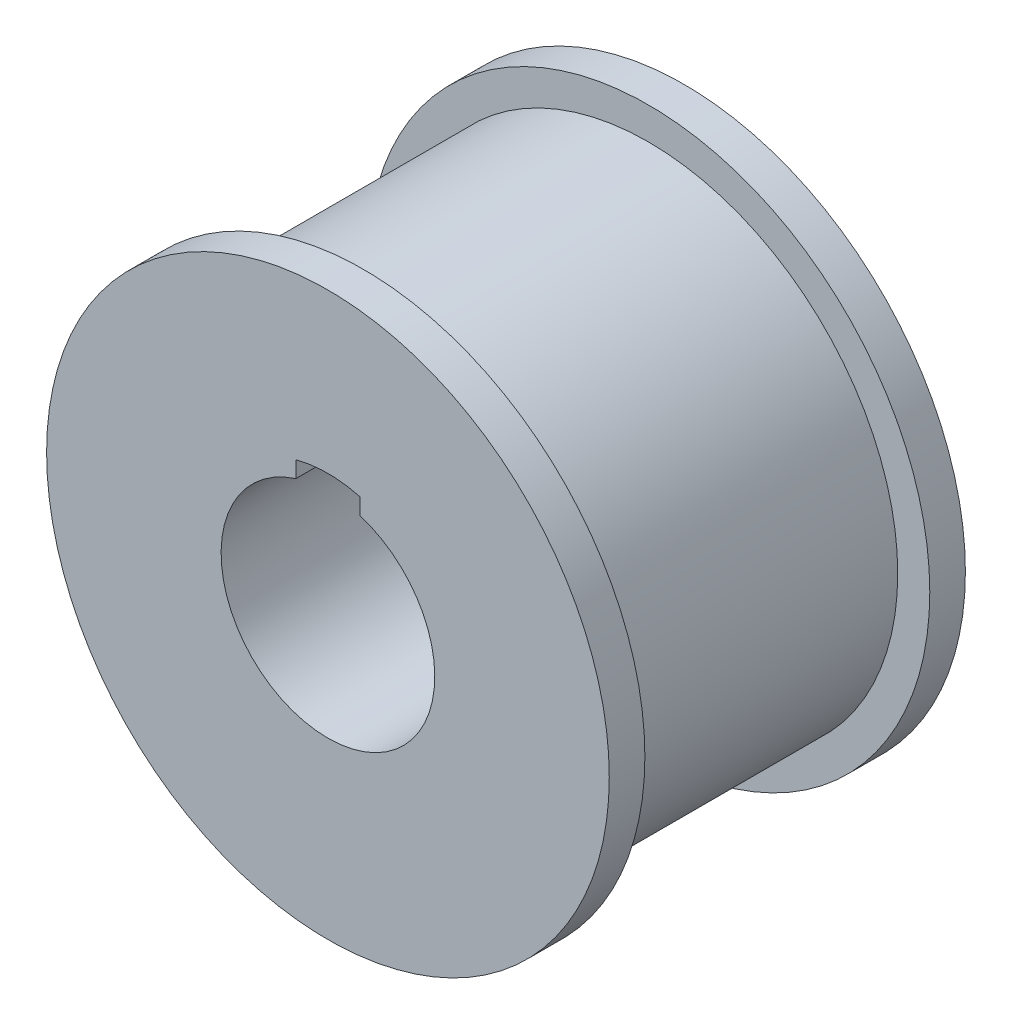
ISO-10303-21;
HEADER;
FILE_DESCRIPTION(('STEP AP214'),'2;1');
FILE_NAME('part.step','',(''),(''),'','','');
FILE_SCHEMA(('AUTOMOTIVE_DESIGN { 1 0 10303 214 1 1 1 1 }'));
ENDSEC;
DATA;
#1=APPLICATION_CONTEXT('core data for automotive mechanical design processes');
#2=APPLICATION_PROTOCOL_DEFINITION('international standard','automotive_design',2000,#1);
#3=PRODUCT_CONTEXT('',#1,'mechanical');
#4=PRODUCT('Part','Part','',(#3));
#5=PRODUCT_RELATED_PRODUCT_CATEGORY('part','',(#4));
#6=PRODUCT_DEFINITION_FORMATION('','',#4);
#7=PRODUCT_DEFINITION_CONTEXT('part definition',#1,'design');
#8=PRODUCT_DEFINITION('design','',#6,#7);
#9=PRODUCT_DEFINITION_SHAPE('','',#8);
#10=(LENGTH_UNIT() NAMED_UNIT(*) SI_UNIT(.MILLI.,.METRE.));
#11=(NAMED_UNIT(*) PLANE_ANGLE_UNIT() SI_UNIT($,.RADIAN.));
#12=(NAMED_UNIT(*) SI_UNIT($,.STERADIAN.) SOLID_ANGLE_UNIT());
#13=UNCERTAINTY_MEASURE_WITH_UNIT(LENGTH_MEASURE(1.E-05),#10,'distance_accuracy_value','');
#14=(GEOMETRIC_REPRESENTATION_CONTEXT(3) GLOBAL_UNCERTAINTY_ASSIGNED_CONTEXT((#13)) GLOBAL_UNIT_ASSIGNED_CONTEXT((#10,
#11,#12)) REPRESENTATION_CONTEXT('',''));
#15=CARTESIAN_POINT('',(0.,0.,0.));
#16=DIRECTION('',(0.,0.,1.));
#17=DIRECTION('',(1.,0.,0.));
#18=AXIS2_PLACEMENT_3D('',#15,#16,#17);
#19=CARTESIAN_POINT('',(0.,0.,40.));
#20=DIRECTION('',(0.,0.,-1.));
#21=DIRECTION('',(-1.,0.,0.));
#22=AXIS2_PLACEMENT_3D('',#19,#20,#21);
#23=CYLINDRICAL_SURFACE('',#22,70.);
#24=CARTESIAN_POINT('',(0.,0.,40.));
#25=DIRECTION('',(0.,0.,1.));
#26=DIRECTION('',(1.,0.,0.));
#27=AXIS2_PLACEMENT_3D('',#24,#25,#26);
#28=CIRCLE('',#27,70.);
#29=CARTESIAN_POINT('',(70.,0.,40.));
#30=VERTEX_POINT('',#29);
#31=EDGE_CURVE('E40',#30,#30,#28,.T.);
#32=ORIENTED_EDGE('',*,*,#31,.F.);
#33=EDGE_LOOP('',(#32));
#34=FACE_BOUND('',#33,.T.);
#35=CARTESIAN_POINT('',(0.,0.,-40.));
#36=DIRECTION('',(0.,0.,1.));
#37=DIRECTION('',(1.,0.,0.));
#38=AXIS2_PLACEMENT_3D('',#35,#36,#37);
#39=CIRCLE('',#38,70.);
#40=CARTESIAN_POINT('',(70.,0.,-40.));
#41=VERTEX_POINT('',#40);
#42=EDGE_CURVE('E105',#41,#41,#39,.T.);
#43=ORIENTED_EDGE('',*,*,#42,.T.);
#44=EDGE_LOOP('',(#43));
#45=FACE_BOUND('',#44,.T.);
#46=ADVANCED_FACE('F33',(#34,#45),#23,.T.);
#47=CARTESIAN_POINT('',(0.,0.,40.));
#48=DIRECTION('',(0.,0.,-1.));
#49=DIRECTION('',(-1.,0.,0.));
#50=AXIS2_PLACEMENT_3D('',#47,#48,#49);
#51=CYLINDRICAL_SURFACE('',#50,30.);
#52=DIRECTION('',(0.,0.,-1.));
#53=VECTOR('',#52,1.);
#54=CARTESIAN_POINT('',(-9.,28.6181760425084,40.));
#55=LINE('',#54,#53);
#56=CARTESIAN_POINT('',(-9.,28.6181760425084,50.));
#57=VERTEX_POINT('',#56);
#58=CARTESIAN_POINT('',(-9.,28.6181760425084,-50.));
#59=VERTEX_POINT('',#58);
#60=EDGE_CURVE('E55',#57,#59,#55,.T.);
#61=ORIENTED_EDGE('',*,*,#60,.F.);
#62=CARTESIAN_POINT('',(0.,0.,50.));
#63=DIRECTION('',(0.,0.,1.));
#64=DIRECTION('',(1.,0.,0.));
#65=AXIS2_PLACEMENT_3D('',#62,#63,#64);
#66=CIRCLE('',#65,30.);
#67=CARTESIAN_POINT('',(9.,28.6181760425084,50.));
#68=VERTEX_POINT('',#67);
#69=EDGE_CURVE('E108',#57,#68,#66,.T.);
#70=ORIENTED_EDGE('',*,*,#69,.T.);
#71=DIRECTION('',(0.,0.,-1.));
#72=VECTOR('',#71,1.);
#73=CARTESIAN_POINT('',(9.,28.6181760425084,40.));
#74=LINE('',#73,#72);
#75=CARTESIAN_POINT('',(9.,28.6181760425084,-50.));
#76=VERTEX_POINT('',#75);
#77=EDGE_CURVE('E77',#76,#68,#74,.F.);
#78=ORIENTED_EDGE('',*,*,#77,.F.);
#79=CARTESIAN_POINT('',(0.,0.,-50.));
#80=DIRECTION('',(0.,0.,1.));
#81=DIRECTION('',(1.,0.,0.));
#82=AXIS2_PLACEMENT_3D('',#79,#80,#81);
#83=CIRCLE('',#82,30.);
#84=EDGE_CURVE('E99',#59,#76,#83,.T.);
#85=ORIENTED_EDGE('',*,*,#84,.F.);
#86=EDGE_LOOP('',(#61,#70,#78,#85));
#87=FACE_BOUND('',#86,.T.);
#88=ADVANCED_FACE('F143',(#87),#51,.F.);
#89=CARTESIAN_POINT('',(0.,0.,50.));
#90=DIRECTION('',(0.,0.,1.));
#91=DIRECTION('',(1.,0.,0.));
#92=AXIS2_PLACEMENT_3D('',#89,#90,#91);
#93=PLANE('',#92);
#94=DIRECTION('',(0.,-1.,0.));
#95=VECTOR('',#94,1.);
#96=CARTESIAN_POINT('',(-9.,16.3702544241175,50.));
#97=LINE('',#96,#95);
#98=CARTESIAN_POINT('',(-9.,33.2018071797304,50.));
#99=VERTEX_POINT('',#98);
#100=EDGE_CURVE('E89',#99,#57,#97,.T.);
#101=ORIENTED_EDGE('',*,*,#100,.F.);
#102=CARTESIAN_POINT('',(0.,0.,50.));
#103=DIRECTION('',(0.,0.,1.));
#104=DIRECTION('',(1.,0.,0.));
#105=AXIS2_PLACEMENT_3D('',#102,#103,#104);
#106=CIRCLE('',#105,34.4);
#107=CARTESIAN_POINT('',(9.,33.2018071797304,50.));
#108=VERTEX_POINT('',#107);
#109=EDGE_CURVE('E75',#108,#99,#106,.T.);
#110=ORIENTED_EDGE('',*,*,#109,.F.);
#111=DIRECTION('',(0.,1.,0.));
#112=VECTOR('',#111,1.);
#113=CARTESIAN_POINT('',(9.,16.3702544241175,50.));
#114=LINE('',#113,#112);
#115=EDGE_CURVE('E93',#68,#108,#114,.T.);
#116=ORIENTED_EDGE('',*,*,#115,.F.);
#117=ORIENTED_EDGE('',*,*,#69,.F.);
#118=EDGE_LOOP('',(#101,#110,#116,#117));
#119=FACE_BOUND('',#118,.T.);
#120=CARTESIAN_POINT('',(0.,0.,50.));
#121=DIRECTION('',(0.,0.,1.));
#122=DIRECTION('',(1.,0.,0.));
#123=AXIS2_PLACEMENT_3D('',#120,#121,#122);
#124=CIRCLE('',#123,79.);
#125=CARTESIAN_POINT('',(79.,0.,50.));
#126=VERTEX_POINT('',#125);
#127=EDGE_CURVE('E112',#126,#126,#124,.T.);
#128=ORIENTED_EDGE('',*,*,#127,.T.);
#129=EDGE_LOOP('',(#128));
#130=FACE_BOUND('',#129,.T.);
#131=ADVANCED_FACE('F148',(#119,#130),#93,.T.);
#132=CARTESIAN_POINT('',(0.,0.,40.));
#133=DIRECTION('',(0.,0.,1.));
#134=DIRECTION('',(1.,0.,0.));
#135=AXIS2_PLACEMENT_3D('',#132,#133,#134);
#136=PLANE('',#135);
#137=ORIENTED_EDGE('',*,*,#31,.T.);
#138=EDGE_LOOP('',(#137));
#139=FACE_BOUND('',#138,.T.);
#140=CARTESIAN_POINT('',(0.,0.,40.));
#141=DIRECTION('',(0.,0.,1.));
#142=DIRECTION('',(1.,0.,0.));
#143=AXIS2_PLACEMENT_3D('',#140,#141,#142);
#144=CIRCLE('',#143,79.);
#145=CARTESIAN_POINT('',(79.,0.,40.));
#146=VERTEX_POINT('',#145);
#147=EDGE_CURVE('E111',#146,#146,#144,.T.);
#148=ORIENTED_EDGE('',*,*,#147,.F.);
#149=EDGE_LOOP('',(#148));
#150=FACE_BOUND('',#149,.T.);
#151=ADVANCED_FACE('F138',(#139,#150),#136,.F.);
#152=CARTESIAN_POINT('',(0.,0.,50.));
#153=DIRECTION('',(0.,0.,-1.));
#154=DIRECTION('',(-1.,0.,0.));
#155=AXIS2_PLACEMENT_3D('',#152,#153,#154);
#156=CYLINDRICAL_SURFACE('',#155,79.);
#157=ORIENTED_EDGE('',*,*,#127,.F.);
#158=EDGE_LOOP('',(#157));
#159=FACE_BOUND('',#158,.T.);
#160=ORIENTED_EDGE('',*,*,#147,.T.);
#161=EDGE_LOOP('',(#160));
#162=FACE_BOUND('',#161,.T.);
#163=ADVANCED_FACE('F130',(#159,#162),#156,.T.);
#164=CARTESIAN_POINT('',(0.,0.,-50.));
#165=DIRECTION('',(0.,0.,1.));
#166=DIRECTION('',(1.,0.,0.));
#167=AXIS2_PLACEMENT_3D('',#164,#165,#166);
#168=CYLINDRICAL_SURFACE('',#167,79.);
#169=CARTESIAN_POINT('',(0.,0.,-50.));
#170=DIRECTION('',(0.,0.,1.));
#171=DIRECTION('',(1.,0.,0.));
#172=AXIS2_PLACEMENT_3D('',#169,#170,#171);
#173=CIRCLE('',#172,79.);
#174=CARTESIAN_POINT('',(79.,0.,-50.));
#175=VERTEX_POINT('',#174);
#176=EDGE_CURVE('E102',#175,#175,#173,.T.);
#177=ORIENTED_EDGE('',*,*,#176,.T.);
#178=EDGE_LOOP('',(#177));
#179=FACE_BOUND('',#178,.T.);
#180=CARTESIAN_POINT('',(0.,0.,-40.));
#181=DIRECTION('',(0.,0.,1.));
#182=DIRECTION('',(1.,0.,0.));
#183=AXIS2_PLACEMENT_3D('',#180,#181,#182);
#184=CIRCLE('',#183,79.);
#185=CARTESIAN_POINT('',(79.,0.,-40.));
#186=VERTEX_POINT('',#185);
#187=EDGE_CURVE('E101',#186,#186,#184,.T.);
#188=ORIENTED_EDGE('',*,*,#187,.F.);
#189=EDGE_LOOP('',(#188));
#190=FACE_BOUND('',#189,.T.);
#191=ADVANCED_FACE('F128',(#179,#190),#168,.T.);
#192=CARTESIAN_POINT('',(0.,0.,-50.));
#193=DIRECTION('',(0.,0.,-1.));
#194=DIRECTION('',(1.,0.,0.));
#195=AXIS2_PLACEMENT_3D('',#192,#193,#194);
#196=PLANE('',#195);
#197=DIRECTION('',(0.,-1.,0.));
#198=VECTOR('',#197,1.);
#199=CARTESIAN_POINT('',(-9.,16.3702544241175,-50.));
#200=LINE('',#199,#198);
#201=CARTESIAN_POINT('',(-9.,33.2018071797304,-50.));
#202=VERTEX_POINT('',#201);
#203=EDGE_CURVE('E80',#202,#59,#200,.T.);
#204=ORIENTED_EDGE('',*,*,#203,.T.);
#205=ORIENTED_EDGE('',*,*,#84,.T.);
#206=DIRECTION('',(0.,-1.,0.));
#207=VECTOR('',#206,1.);
#208=CARTESIAN_POINT('',(9.00000000000001,0.,-50.));
#209=LINE('',#208,#207);
#210=CARTESIAN_POINT('',(9.,33.2018071797304,-50.));
#211=VERTEX_POINT('',#210);
#212=EDGE_CURVE('E11',#211,#76,#209,.T.);
#213=ORIENTED_EDGE('',*,*,#212,.F.);
#214=CARTESIAN_POINT('',(0.,0.,-50.));
#215=DIRECTION('',(0.,0.,1.));
#216=DIRECTION('',(1.,0.,0.));
#217=AXIS2_PLACEMENT_3D('',#214,#215,#216);
#218=CIRCLE('',#217,34.4);
#219=EDGE_CURVE('E47',#211,#202,#218,.T.);
#220=ORIENTED_EDGE('',*,*,#219,.T.);
#221=EDGE_LOOP('',(#204,#205,#213,#220));
#222=FACE_BOUND('',#221,.T.);
#223=ORIENTED_EDGE('',*,*,#176,.F.);
#224=EDGE_LOOP('',(#223));
#225=FACE_BOUND('',#224,.T.);
#226=ADVANCED_FACE('F87',(#222,#225),#196,.T.);
#227=CARTESIAN_POINT('',(0.,0.,-40.));
#228=DIRECTION('',(0.,0.,-1.));
#229=DIRECTION('',(1.,0.,0.));
#230=AXIS2_PLACEMENT_3D('',#227,#228,#229);
#231=PLANE('',#230);
#232=ORIENTED_EDGE('',*,*,#42,.F.);
#233=EDGE_LOOP('',(#232));
#234=FACE_BOUND('',#233,.T.);
#235=ORIENTED_EDGE('',*,*,#187,.T.);
#236=EDGE_LOOP('',(#235));
#237=FACE_BOUND('',#236,.T.);
#238=ADVANCED_FACE('F122',(#234,#237),#231,.F.);
#239=CARTESIAN_POINT('',(-9.,16.3702544241175,-50.));
#240=DIRECTION('',(-1.,0.,0.));
#241=DIRECTION('',(0.,-1.,0.));
#242=AXIS2_PLACEMENT_3D('',#239,#240,#241);
#243=PLANE('',#242);
#244=ORIENTED_EDGE('',*,*,#60,.T.);
#245=ORIENTED_EDGE('',*,*,#203,.F.);
#246=DIRECTION('',(0.,0.,1.));
#247=VECTOR('',#246,1.);
#248=CARTESIAN_POINT('',(-9.,33.2018071797304,-50.));
#249=LINE('',#248,#247);
#250=EDGE_CURVE('E72',#202,#99,#249,.T.);
#251=ORIENTED_EDGE('',*,*,#250,.T.);
#252=ORIENTED_EDGE('',*,*,#100,.T.);
#253=EDGE_LOOP('',(#244,#245,#251,#252));
#254=FACE_BOUND('',#253,.T.);
#255=ADVANCED_FACE('F81',(#254),#243,.F.);
#256=CARTESIAN_POINT('',(0.,0.,-50.));
#257=DIRECTION('',(0.,0.,1.));
#258=DIRECTION('',(1.,0.,0.));
#259=AXIS2_PLACEMENT_3D('',#256,#257,#258);
#260=CYLINDRICAL_SURFACE('',#259,34.4);
#261=ORIENTED_EDGE('',*,*,#109,.T.);
#262=ORIENTED_EDGE('',*,*,#250,.F.);
#263=ORIENTED_EDGE('',*,*,#219,.F.);
#264=DIRECTION('',(0.,0.,1.));
#265=VECTOR('',#264,1.);
#266=CARTESIAN_POINT('',(9.,33.2018071797304,-50.));
#267=LINE('',#266,#265);
#268=EDGE_CURVE('E78',#211,#108,#267,.T.);
#269=ORIENTED_EDGE('',*,*,#268,.T.);
#270=EDGE_LOOP('',(#261,#262,#263,#269));
#271=FACE_BOUND('',#270,.T.);
#272=ADVANCED_FACE('F73',(#271),#260,.F.);
#273=CARTESIAN_POINT('',(9.,16.3702544241175,-50.));
#274=DIRECTION('',(1.,0.,0.));
#275=DIRECTION('',(0.,1.,0.));
#276=AXIS2_PLACEMENT_3D('',#273,#274,#275);
#277=PLANE('',#276);
#278=ORIENTED_EDGE('',*,*,#77,.T.);
#279=ORIENTED_EDGE('',*,*,#115,.T.);
#280=ORIENTED_EDGE('',*,*,#268,.F.);
#281=ORIENTED_EDGE('',*,*,#212,.T.);
#282=EDGE_LOOP('',(#278,#279,#280,#281));
#283=FACE_BOUND('',#282,.T.);
#284=ADVANCED_FACE('F169',(#283),#277,.F.);
#285=CLOSED_SHELL('',(#46,#88,#131,#151,#163,#191,#226,#238,#255,#272,#284));
#286=MANIFOLD_SOLID_BREP('B2',#285);
#287=ADVANCED_BREP_SHAPE_REPRESENTATION('',(#18,#286),#14);
#288=SHAPE_DEFINITION_REPRESENTATION(#9,#287);
ENDSEC;
END-ISO-10303-21;
